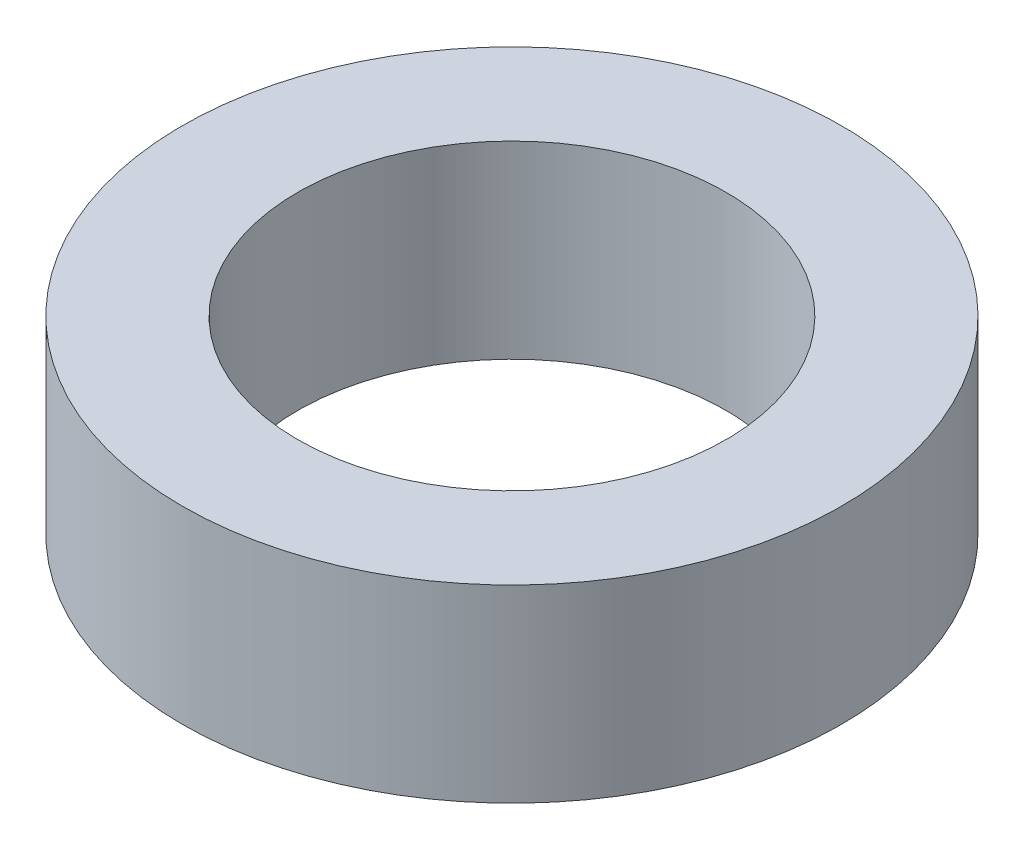
ISO-10303-21;
HEADER;
FILE_DESCRIPTION(('STEP AP214'),'2;1');
FILE_NAME('part.step','',(''),(''),'','','');
FILE_SCHEMA(('AUTOMOTIVE_DESIGN { 1 0 10303 214 1 1 1 1 }'));
ENDSEC;
DATA;
#1=APPLICATION_CONTEXT('core data for automotive mechanical design processes');
#2=APPLICATION_PROTOCOL_DEFINITION('international standard','automotive_design',2000,#1);
#3=PRODUCT_CONTEXT('',#1,'mechanical');
#4=PRODUCT('Part','Part','',(#3));
#5=PRODUCT_RELATED_PRODUCT_CATEGORY('part','',(#4));
#6=PRODUCT_DEFINITION_FORMATION('','',#4);
#7=PRODUCT_DEFINITION_CONTEXT('part definition',#1,'design');
#8=PRODUCT_DEFINITION('design','',#6,#7);
#9=PRODUCT_DEFINITION_SHAPE('','',#8);
#10=(LENGTH_UNIT() NAMED_UNIT(*) SI_UNIT(.MILLI.,.METRE.));
#11=(NAMED_UNIT(*) PLANE_ANGLE_UNIT() SI_UNIT($,.RADIAN.));
#12=(NAMED_UNIT(*) SI_UNIT($,.STERADIAN.) SOLID_ANGLE_UNIT());
#13=UNCERTAINTY_MEASURE_WITH_UNIT(LENGTH_MEASURE(1.E-05),#10,'distance_accuracy_value','');
#14=(GEOMETRIC_REPRESENTATION_CONTEXT(3) GLOBAL_UNCERTAINTY_ASSIGNED_CONTEXT((#13)) GLOBAL_UNIT_ASSIGNED_CONTEXT((#10,
#11,#12)) REPRESENTATION_CONTEXT('',''));
#15=CARTESIAN_POINT('',(0.,0.,0.));
#16=DIRECTION('',(0.,0.,1.));
#17=DIRECTION('',(1.,0.,0.));
#18=AXIS2_PLACEMENT_3D('',#15,#16,#17);
#19=CARTESIAN_POINT('',(0.,1.72,0.));
#20=DIRECTION('',(0.,-1.,0.));
#21=DIRECTION('',(0.,0.,-1.));
#22=AXIS2_PLACEMENT_3D('',#19,#20,#21);
#23=CYLINDRICAL_SURFACE('',#22,3.);
#24=CARTESIAN_POINT('',(0.,1.72,0.));
#25=DIRECTION('',(0.,1.,0.));
#26=DIRECTION('',(0.,0.,1.));
#27=AXIS2_PLACEMENT_3D('',#24,#25,#26);
#28=CIRCLE('',#27,3.);
#29=CARTESIAN_POINT('',(0.,1.72,3.));
#30=VERTEX_POINT('',#29);
#31=EDGE_CURVE('E10',#30,#30,#28,.T.);
#32=ORIENTED_EDGE('',*,*,#31,.F.);
#33=EDGE_LOOP('',(#32));
#34=FACE_BOUND('',#33,.T.);
#35=CARTESIAN_POINT('',(0.,0.,0.));
#36=DIRECTION('',(0.,1.,0.));
#37=DIRECTION('',(0.,0.,1.));
#38=AXIS2_PLACEMENT_3D('',#35,#36,#37);
#39=CIRCLE('',#38,3.);
#40=CARTESIAN_POINT('',(0.,0.,3.));
#41=VERTEX_POINT('',#40);
#42=EDGE_CURVE('E38',#41,#41,#39,.T.);
#43=ORIENTED_EDGE('',*,*,#42,.T.);
#44=EDGE_LOOP('',(#43));
#45=FACE_BOUND('',#44,.T.);
#46=ADVANCED_FACE('F35',(#34,#45),#23,.T.);
#47=CARTESIAN_POINT('',(0.,1.72,0.));
#48=DIRECTION('',(0.,1.,0.));
#49=DIRECTION('',(0.,0.,1.));
#50=AXIS2_PLACEMENT_3D('',#47,#48,#49);
#51=PLANE('',#50);
#52=CARTESIAN_POINT('',(0.,1.72,0.));
#53=DIRECTION('',(0.,1.,0.));
#54=DIRECTION('',(0.,0.,1.));
#55=AXIS2_PLACEMENT_3D('',#52,#53,#54);
#56=CIRCLE('',#55,1.94999999999999);
#57=CARTESIAN_POINT('',(0.,1.72,1.94999999999999));
#58=VERTEX_POINT('',#57);
#59=EDGE_CURVE('E49',#58,#58,#56,.T.);
#60=ORIENTED_EDGE('',*,*,#59,.F.);
#61=EDGE_LOOP('',(#60));
#62=FACE_BOUND('',#61,.T.);
#63=ORIENTED_EDGE('',*,*,#31,.T.);
#64=EDGE_LOOP('',(#63));
#65=FACE_BOUND('',#64,.T.);
#66=ADVANCED_FACE('F55',(#62,#65),#51,.T.);
#67=CARTESIAN_POINT('',(0.,0.,0.));
#68=DIRECTION('',(0.,1.,0.));
#69=DIRECTION('',(0.,0.,1.));
#70=AXIS2_PLACEMENT_3D('',#67,#68,#69);
#71=PLANE('',#70);
#72=CARTESIAN_POINT('',(0.,0.,0.));
#73=DIRECTION('',(0.,1.,0.));
#74=DIRECTION('',(0.,0.,1.));
#75=AXIS2_PLACEMENT_3D('',#72,#73,#74);
#76=CIRCLE('',#75,1.95);
#77=CARTESIAN_POINT('',(0.,0.,1.95));
#78=VERTEX_POINT('',#77);
#79=EDGE_CURVE('E45',#78,#78,#76,.T.);
#80=ORIENTED_EDGE('',*,*,#79,.T.);
#81=EDGE_LOOP('',(#80));
#82=FACE_BOUND('',#81,.T.);
#83=ORIENTED_EDGE('',*,*,#42,.F.);
#84=EDGE_LOOP('',(#83));
#85=FACE_BOUND('',#84,.T.);
#86=ADVANCED_FACE('F57',(#82,#85),#71,.F.);
#87=CARTESIAN_POINT('',(0.,1.72,0.));
#88=DIRECTION('',(0.,1.,0.));
#89=DIRECTION('',(0.,0.,1.));
#90=AXIS2_PLACEMENT_3D('',#87,#88,#89);
#91=CYLINDRICAL_SURFACE('',#90,1.94999999999999);
#92=ORIENTED_EDGE('',*,*,#79,.F.);
#93=EDGE_LOOP('',(#92));
#94=FACE_BOUND('',#93,.T.);
#95=ORIENTED_EDGE('',*,*,#59,.T.);
#96=EDGE_LOOP('',(#95));
#97=FACE_BOUND('',#96,.T.);
#98=ADVANCED_FACE('F53',(#94,#97),#91,.F.);
#99=CLOSED_SHELL('',(#46,#66,#86,#98));
#100=MANIFOLD_SOLID_BREP('B2',#99);
#101=ADVANCED_BREP_SHAPE_REPRESENTATION('',(#18,#100),#14);
#102=SHAPE_DEFINITION_REPRESENTATION(#9,#101);
ENDSEC;
END-ISO-10303-21;
